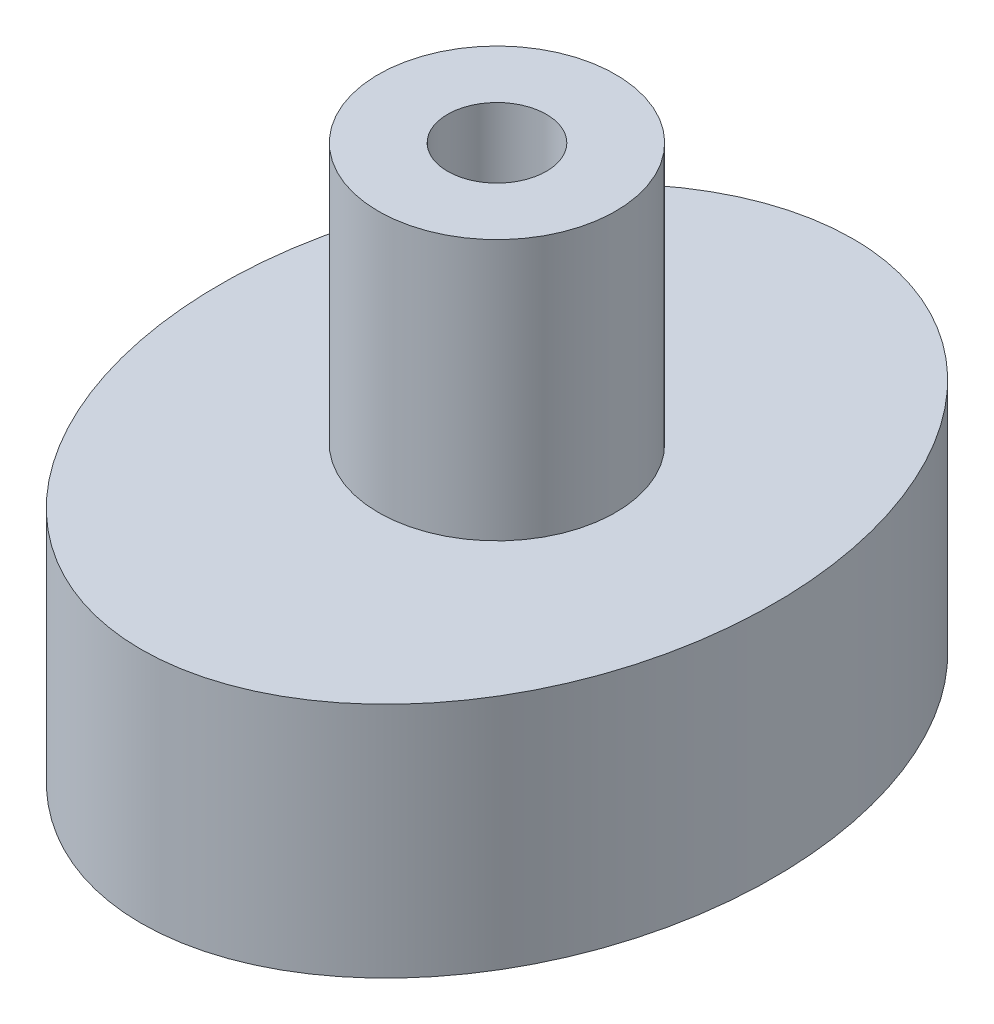
ISO-10303-21;
HEADER;
FILE_DESCRIPTION(('STEP AP214'),'2;1');
FILE_NAME('part.step','',(''),(''),'','','');
FILE_SCHEMA(('AUTOMOTIVE_DESIGN { 1 0 10303 214 1 1 1 1 }'));
ENDSEC;
DATA;
#1=APPLICATION_CONTEXT('core data for automotive mechanical design processes');
#2=APPLICATION_PROTOCOL_DEFINITION('international standard','automotive_design',2000,#1);
#3=PRODUCT_CONTEXT('',#1,'mechanical');
#4=PRODUCT('Part','Part','',(#3));
#5=PRODUCT_RELATED_PRODUCT_CATEGORY('part','',(#4));
#6=PRODUCT_DEFINITION_FORMATION('','',#4);
#7=PRODUCT_DEFINITION_CONTEXT('part definition',#1,'design');
#8=PRODUCT_DEFINITION('design','',#6,#7);
#9=PRODUCT_DEFINITION_SHAPE('','',#8);
#10=(LENGTH_UNIT() NAMED_UNIT(*) SI_UNIT(.MILLI.,.METRE.));
#11=(NAMED_UNIT(*) PLANE_ANGLE_UNIT() SI_UNIT($,.RADIAN.));
#12=(NAMED_UNIT(*) SI_UNIT($,.STERADIAN.) SOLID_ANGLE_UNIT());
#13=UNCERTAINTY_MEASURE_WITH_UNIT(LENGTH_MEASURE(1.E-05),#10,'distance_accuracy_value','');
#14=(GEOMETRIC_REPRESENTATION_CONTEXT(3) GLOBAL_UNCERTAINTY_ASSIGNED_CONTEXT((#13)) GLOBAL_UNIT_ASSIGNED_CONTEXT((#10,
#11,#12)) REPRESENTATION_CONTEXT('',''));
#15=CARTESIAN_POINT('',(0.,0.,0.));
#16=DIRECTION('',(0.,0.,1.));
#17=DIRECTION('',(1.,0.,0.));
#18=AXIS2_PLACEMENT_3D('',#15,#16,#17);
#19=CARTESIAN_POINT('',(0.,5.842,0.));
#20=DIRECTION('',(0.,-1.,0.));
#21=DIRECTION('',(0.,0.,-1.));
#22=AXIS2_PLACEMENT_3D('',#19,#20,#21);
#23=CYLINDRICAL_SURFACE('',#22,25.4);
#24=CARTESIAN_POINT('',(0.,5.842,0.));
#25=DIRECTION('',(0.,1.,0.));
#26=DIRECTION('',(0.,0.,1.));
#27=AXIS2_PLACEMENT_3D('',#24,#25,#26);
#28=CIRCLE('',#27,25.4);
#29=CARTESIAN_POINT('',(0.,5.842,25.4));
#30=VERTEX_POINT('',#29);
#31=EDGE_CURVE('E37',#30,#30,#28,.T.);
#32=ORIENTED_EDGE('',*,*,#31,.F.);
#33=EDGE_LOOP('',(#32));
#34=FACE_BOUND('',#33,.T.);
#35=CARTESIAN_POINT('',(0.,0.,0.));
#36=DIRECTION('',(0.,1.,0.));
#37=DIRECTION('',(0.,0.,1.));
#38=AXIS2_PLACEMENT_3D('',#35,#36,#37);
#39=CIRCLE('',#38,25.4);
#40=CARTESIAN_POINT('',(0.,0.,25.4));
#41=VERTEX_POINT('',#40);
#42=EDGE_CURVE('E33',#41,#41,#39,.T.);
#43=ORIENTED_EDGE('',*,*,#42,.T.);
#44=EDGE_LOOP('',(#43));
#45=FACE_BOUND('',#44,.T.);
#46=ADVANCED_FACE('F30',(#34,#45),#23,.T.);
#47=CARTESIAN_POINT('',(0.,0.,0.));
#48=DIRECTION('',(0.,1.,0.));
#49=DIRECTION('',(0.,0.,1.));
#50=AXIS2_PLACEMENT_3D('',#47,#48,#49);
#51=PLANE('',#50);
#52=CARTESIAN_POINT('',(0.,0.,0.));
#53=DIRECTION('',(0.,1.,0.));
#54=DIRECTION('',(0.,0.,1.));
#55=AXIS2_PLACEMENT_3D('',#52,#53,#54);
#56=CIRCLE('',#55,6.35);
#57=CARTESIAN_POINT('',(0.,0.,6.35));
#58=VERTEX_POINT('',#57);
#59=EDGE_CURVE('E71',#58,#58,#56,.T.);
#60=ORIENTED_EDGE('',*,*,#59,.T.);
#61=EDGE_LOOP('',(#60));
#62=FACE_BOUND('',#61,.T.);
#63=ORIENTED_EDGE('',*,*,#42,.F.);
#64=EDGE_LOOP('',(#63));
#65=FACE_BOUND('',#64,.T.);
#66=ADVANCED_FACE('F56',(#62,#65),#51,.F.);
#67=CARTESIAN_POINT('',(0.,36.322,0.));
#68=DIRECTION('',(0.,1.,0.));
#69=DIRECTION('',(0.,0.,-1.));
#70=AXIS2_PLACEMENT_3D('',#67,#68,#69);
#71=ELLIPSE('',#70,45.72,35.56);
#72=DIRECTION('',(0.,-1.,0.));
#73=VECTOR('',#72,1.);
#74=SURFACE_OF_LINEAR_EXTRUSION('',#71,#73);
#75=CARTESIAN_POINT('',(0.,36.322,-45.72));
#76=VERTEX_POINT('',#75);
#77=EDGE_CURVE('E46',#76,#76,#71,.T.);
#78=ORIENTED_EDGE('',*,*,#77,.F.);
#79=EDGE_LOOP('',(#78));
#80=FACE_BOUND('',#79,.T.);
#81=CARTESIAN_POINT('',(0.,5.842,0.));
#82=DIRECTION('',(0.,1.,0.));
#83=DIRECTION('',(0.,0.,-1.));
#84=AXIS2_PLACEMENT_3D('',#81,#82,#83);
#85=ELLIPSE('',#84,45.72,35.56);
#86=CARTESIAN_POINT('',(0.,5.842,-45.72));
#87=VERTEX_POINT('',#86);
#88=EDGE_CURVE('E50',#87,#87,#85,.T.);
#89=ORIENTED_EDGE('',*,*,#88,.T.);
#90=EDGE_LOOP('',(#89));
#91=FACE_BOUND('',#90,.T.);
#92=ADVANCED_FACE('F52',(#80,#91),#74,.F.);
#93=CARTESIAN_POINT('',(0.,36.322,0.));
#94=DIRECTION('',(0.,1.,0.));
#95=DIRECTION('',(0.,0.,1.));
#96=AXIS2_PLACEMENT_3D('',#93,#94,#95);
#97=PLANE('',#96);
#98=CARTESIAN_POINT('',(0.,36.322,0.));
#99=DIRECTION('',(0.,1.,0.));
#100=DIRECTION('',(0.,0.,1.));
#101=AXIS2_PLACEMENT_3D('',#98,#99,#100);
#102=CIRCLE('',#101,15.24);
#103=CARTESIAN_POINT('',(0.,36.322,15.24));
#104=VERTEX_POINT('',#103);
#105=EDGE_CURVE('E10',#104,#104,#102,.T.);
#106=ORIENTED_EDGE('',*,*,#105,.F.);
#107=EDGE_LOOP('',(#106));
#108=FACE_BOUND('',#107,.T.);
#109=ORIENTED_EDGE('',*,*,#77,.T.);
#110=EDGE_LOOP('',(#109));
#111=FACE_BOUND('',#110,.T.);
#112=ADVANCED_FACE('F55',(#108,#111),#97,.T.);
#113=CARTESIAN_POINT('',(0.,5.842,0.));
#114=DIRECTION('',(0.,1.,0.));
#115=DIRECTION('',(0.,0.,1.));
#116=AXIS2_PLACEMENT_3D('',#113,#114,#115);
#117=PLANE('',#116);
#118=ORIENTED_EDGE('',*,*,#31,.T.);
#119=EDGE_LOOP('',(#118));
#120=FACE_BOUND('',#119,.T.);
#121=ORIENTED_EDGE('',*,*,#88,.F.);
#122=EDGE_LOOP('',(#121));
#123=FACE_BOUND('',#122,.T.);
#124=ADVANCED_FACE('F58',(#120,#123),#117,.F.);
#125=CARTESIAN_POINT('',(0.,69.85,0.));
#126=DIRECTION('',(0.,-1.,0.));
#127=DIRECTION('',(0.,0.,-1.));
#128=AXIS2_PLACEMENT_3D('',#125,#126,#127);
#129=CYLINDRICAL_SURFACE('',#128,15.24);
#130=CARTESIAN_POINT('',(0.,69.85,0.));
#131=DIRECTION('',(0.,1.,0.));
#132=DIRECTION('',(0.,0.,1.));
#133=AXIS2_PLACEMENT_3D('',#130,#131,#132);
#134=CIRCLE('',#133,15.24);
#135=CARTESIAN_POINT('',(0.,69.85,15.24));
#136=VERTEX_POINT('',#135);
#137=EDGE_CURVE('E44',#136,#136,#134,.T.);
#138=ORIENTED_EDGE('',*,*,#137,.F.);
#139=EDGE_LOOP('',(#138));
#140=FACE_BOUND('',#139,.T.);
#141=ORIENTED_EDGE('',*,*,#105,.T.);
#142=EDGE_LOOP('',(#141));
#143=FACE_BOUND('',#142,.T.);
#144=ADVANCED_FACE('F86',(#140,#143),#129,.T.);
#145=CARTESIAN_POINT('',(0.,69.85,0.));
#146=DIRECTION('',(0.,1.,0.));
#147=DIRECTION('',(0.,0.,1.));
#148=AXIS2_PLACEMENT_3D('',#145,#146,#147);
#149=PLANE('',#148);
#150=CARTESIAN_POINT('',(0.,69.85,0.));
#151=DIRECTION('',(0.,1.,0.));
#152=DIRECTION('',(0.,0.,1.));
#153=AXIS2_PLACEMENT_3D('',#150,#151,#152);
#154=CIRCLE('',#153,6.35);
#155=CARTESIAN_POINT('',(0.,69.85,6.35));
#156=VERTEX_POINT('',#155);
#157=EDGE_CURVE('E76',#156,#156,#154,.T.);
#158=ORIENTED_EDGE('',*,*,#157,.F.);
#159=EDGE_LOOP('',(#158));
#160=FACE_BOUND('',#159,.T.);
#161=ORIENTED_EDGE('',*,*,#137,.T.);
#162=EDGE_LOOP('',(#161));
#163=FACE_BOUND('',#162,.T.);
#164=ADVANCED_FACE('F84',(#160,#163),#149,.T.);
#165=CARTESIAN_POINT('',(0.,-1.2E-05,0.));
#166=DIRECTION('',(0.,1.,0.));
#167=DIRECTION('',(0.,0.,1.));
#168=AXIS2_PLACEMENT_3D('',#165,#166,#167);
#169=CYLINDRICAL_SURFACE('',#168,6.35);
#170=CARTESIAN_POINT('',(0.,69.85,6.35));
#171=CARTESIAN_POINT('',(0.,69.1223958333333,6.35));
#172=CARTESIAN_POINT('',(0.,68.3947916666666,6.35));
#173=CARTESIAN_POINT('',(0.,66.9395833333333,6.35));
#174=CARTESIAN_POINT('',(0.,66.2119791666666,6.35));
#175=CARTESIAN_POINT('',(0.,64.7567708333333,6.35));
#176=CARTESIAN_POINT('',(0.,64.0291666666667,6.35));
#177=CARTESIAN_POINT('',(0.,62.5739583333333,6.35));
#178=CARTESIAN_POINT('',(0.,61.8463541666667,6.35));
#179=CARTESIAN_POINT('',(0.,60.3911458333333,6.35));
#180=CARTESIAN_POINT('',(0.,59.6635416666666,6.35));
#181=CARTESIAN_POINT('',(0.,58.2083333333333,6.35));
#182=CARTESIAN_POINT('',(0.,57.4807291666666,6.35));
#183=CARTESIAN_POINT('',(0.,56.0255208333333,6.35));
#184=CARTESIAN_POINT('',(0.,55.2979166666667,6.35));
#185=CARTESIAN_POINT('',(0.,53.8427083333333,6.35));
#186=CARTESIAN_POINT('',(0.,53.1151041666666,6.35));
#187=CARTESIAN_POINT('',(0.,51.6598958333333,6.35));
#188=CARTESIAN_POINT('',(0.,50.9322916666667,6.35));
#189=CARTESIAN_POINT('',(0.,49.4770833333333,6.35));
#190=CARTESIAN_POINT('',(0.,48.7494791666667,6.35));
#191=CARTESIAN_POINT('',(0.,47.2942708333333,6.35));
#192=CARTESIAN_POINT('',(0.,46.5666666666666,6.35));
#193=CARTESIAN_POINT('',(0.,45.1114583333333,6.35));
#194=CARTESIAN_POINT('',(0.,44.3838541666666,6.35));
#195=CARTESIAN_POINT('',(0.,42.9286458333333,6.35));
#196=CARTESIAN_POINT('',(0.,42.2010416666667,6.35));
#197=CARTESIAN_POINT('',(0.,40.7458333333333,6.35));
#198=CARTESIAN_POINT('',(0.,40.0182291666667,6.35));
#199=CARTESIAN_POINT('',(0.,38.5630208333333,6.35));
#200=CARTESIAN_POINT('',(0.,37.8354166666666,6.35));
#201=CARTESIAN_POINT('',(0.,36.3802083333333,6.35));
#202=CARTESIAN_POINT('',(0.,35.6526041666666,6.35));
#203=CARTESIAN_POINT('',(0.,34.1973958333333,6.35));
#204=CARTESIAN_POINT('',(0.,33.4697916666667,6.35));
#205=CARTESIAN_POINT('',(0.,32.0145833333333,6.35));
#206=CARTESIAN_POINT('',(0.,31.2869791666667,6.35));
#207=CARTESIAN_POINT('',(0.,29.8317708333333,6.35));
#208=CARTESIAN_POINT('',(0.,29.1041666666667,6.35));
#209=CARTESIAN_POINT('',(0.,27.6489583333333,6.35));
#210=CARTESIAN_POINT('',(0.,26.9213541666667,6.35));
#211=CARTESIAN_POINT('',(0.,25.4661458333333,6.35));
#212=CARTESIAN_POINT('',(0.,24.7385416666667,6.35));
#213=CARTESIAN_POINT('',(0.,23.2833333333333,6.35));
#214=CARTESIAN_POINT('',(0.,22.5557291666667,6.35));
#215=CARTESIAN_POINT('',(0.,21.1005208333333,6.35));
#216=CARTESIAN_POINT('',(0.,20.3729166666667,6.35));
#217=CARTESIAN_POINT('',(0.,18.9177083333333,6.35));
#218=CARTESIAN_POINT('',(0.,18.1901041666667,6.35));
#219=CARTESIAN_POINT('',(0.,16.7348958333333,6.35));
#220=CARTESIAN_POINT('',(0.,16.0072916666667,6.35));
#221=CARTESIAN_POINT('',(0.,14.5520833333333,6.35));
#222=CARTESIAN_POINT('',(0.,13.8244791666667,6.35));
#223=CARTESIAN_POINT('',(0.,12.3692708333333,6.35));
#224=CARTESIAN_POINT('',(0.,11.6416666666667,6.35));
#225=CARTESIAN_POINT('',(0.,10.1864583333333,6.35));
#226=CARTESIAN_POINT('',(0.,9.45885416666666,6.35));
#227=CARTESIAN_POINT('',(0.,8.00364583333332,6.35));
#228=CARTESIAN_POINT('',(0.,7.27604166666666,6.35));
#229=CARTESIAN_POINT('',(0.,5.82083333333333,6.35));
#230=CARTESIAN_POINT('',(0.,5.09322916666666,6.35));
#231=CARTESIAN_POINT('',(0.,3.63802083333333,6.35));
#232=CARTESIAN_POINT('',(0.,2.91041666666666,6.35));
#233=CARTESIAN_POINT('',(0.,1.45520833333333,6.35));
#234=CARTESIAN_POINT('',(0.,0.727604166666664,6.35));
#235=CARTESIAN_POINT('',(0.,0.,6.35));
#236=B_SPLINE_CURVE_WITH_KNOTS('',3,(#170,#171,#172,#173,#174,#175,#176,#177,#178,#179,#180,
#181,#182,#183,#184,#185,#186,#187,#188,#189,#190,#191,#192,#193,#194,#195,#196,#197,#198,#199,
#200,#201,#202,#203,#204,#205,#206,#207,#208,#209,#210,#211,#212,#213,#214,#215,#216,#217,#218,
#219,#220,#221,#222,#223,#224,#225,#226,#227,#228,#229,#230,#231,#232,#233,#234,#235),
.UNSPECIFIED.,.F.,.F.,(4,2,2,2,2,2,2,2,2,2,2,2,2,2,2,2,2,2,2,2,2,2,2,2,2,2,2,2,2,2,2,2,4),(0.,
2.18281250000001,4.365625,6.5484375,8.73125,10.9140625,13.096875,15.2796875,17.4625,19.6453125,
21.828125,24.0109375,26.19375,28.3765625,30.559375,32.7421875,34.925,37.1078125,39.290625,
41.4734375,43.65625,45.8390625,48.021875,50.2046875,52.3875,54.5703125,56.753125,58.9359375,
61.11875,63.3015625,65.484375,67.6671875,69.85),.UNSPECIFIED.);
#237=EDGE_CURVE('BSEAM82',#156,#58,#236,.T.);
#238=ORIENTED_EDGE('',*,*,#157,.T.);
#239=ORIENTED_EDGE('',*,*,#59,.F.);
#240=ORIENTED_EDGE('',*,*,#237,.T.);
#241=ORIENTED_EDGE('',*,*,#237,.F.);
#242=EDGE_LOOP('',(#238,#240,#239,#241));
#243=FACE_BOUND('',#242,.T.);
#244=ADVANCED_FACE('F82',(#243),#169,.F.);
#245=CLOSED_SHELL('',(#46,#66,#92,#112,#124,#144,#164,#244));
#246=MANIFOLD_SOLID_BREP('B2',#245);
#247=ADVANCED_BREP_SHAPE_REPRESENTATION('',(#18,#246),#14);
#248=SHAPE_DEFINITION_REPRESENTATION(#9,#247);
ENDSEC;
END-ISO-10303-21;
